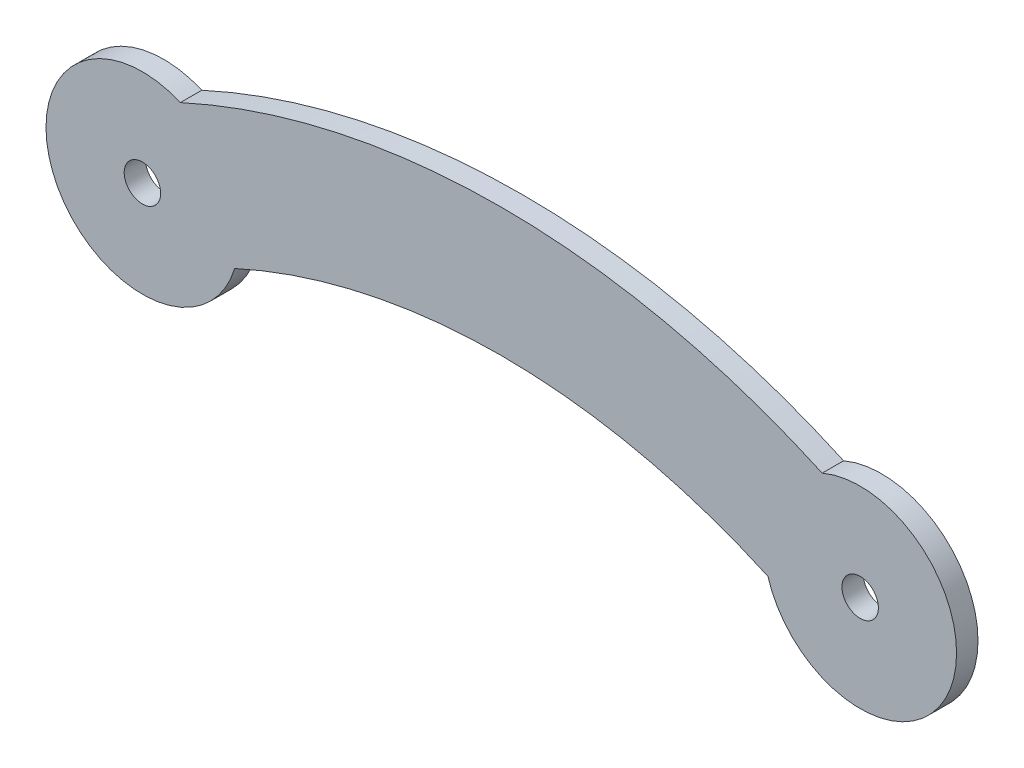
ISO-10303-21;
HEADER;
FILE_DESCRIPTION(('STEP AP214'),'2;1');
FILE_NAME('part.step','',(''),(''),'','','');
FILE_SCHEMA(('AUTOMOTIVE_DESIGN { 1 0 10303 214 1 1 1 1 }'));
ENDSEC;
DATA;
#1=APPLICATION_CONTEXT('core data for automotive mechanical design processes');
#2=APPLICATION_PROTOCOL_DEFINITION('international standard','automotive_design',2000,#1);
#3=PRODUCT_CONTEXT('',#1,'mechanical');
#4=PRODUCT('Part','Part','',(#3));
#5=PRODUCT_RELATED_PRODUCT_CATEGORY('part','',(#4));
#6=PRODUCT_DEFINITION_FORMATION('','',#4);
#7=PRODUCT_DEFINITION_CONTEXT('part definition',#1,'design');
#8=PRODUCT_DEFINITION('design','',#6,#7);
#9=PRODUCT_DEFINITION_SHAPE('','',#8);
#10=(LENGTH_UNIT() NAMED_UNIT(*) SI_UNIT(.MILLI.,.METRE.));
#11=(NAMED_UNIT(*) PLANE_ANGLE_UNIT() SI_UNIT($,.RADIAN.));
#12=(NAMED_UNIT(*) SI_UNIT($,.STERADIAN.) SOLID_ANGLE_UNIT());
#13=UNCERTAINTY_MEASURE_WITH_UNIT(LENGTH_MEASURE(1.E-05),#10,'distance_accuracy_value','');
#14=(GEOMETRIC_REPRESENTATION_CONTEXT(3) GLOBAL_UNCERTAINTY_ASSIGNED_CONTEXT((#13)) GLOBAL_UNIT_ASSIGNED_CONTEXT((#10,
#11,#12)) REPRESENTATION_CONTEXT('',''));
#15=CARTESIAN_POINT('',(0.,0.,0.));
#16=DIRECTION('',(0.,0.,1.));
#17=DIRECTION('',(1.,0.,0.));
#18=AXIS2_PLACEMENT_3D('',#15,#16,#17);
#19=CARTESIAN_POINT('',(25.125,-14.2998387689215,1.));
#20=DIRECTION('',(0.,0.,-1.));
#21=DIRECTION('',(-1.,0.,0.));
#22=AXIS2_PLACEMENT_3D('',#19,#20,#21);
#23=PLANE('',#22);
#24=CARTESIAN_POINT('',(16.75,-28.599677537843,1.));
#25=DIRECTION('',(0.,0.,-1.));
#26=DIRECTION('',(-1.,0.,0.));
#27=AXIS2_PLACEMENT_3D('',#24,#25,#26);
#28=CIRCLE('',#27,30.);
#29=CARTESIAN_POINT('',(4.30766705181558,-1.30153930816647,1.));
#30=VERTEX_POINT('',#29);
#31=CARTESIAN_POINT('',(29.1923329481844,-1.30153930816648,1.));
#32=VERTEX_POINT('',#31);
#33=EDGE_CURVE('E86',#30,#32,#28,.T.);
#34=ORIENTED_EDGE('',*,*,#33,.T.);
#35=CARTESIAN_POINT('',(33.5,0.,1.));
#36=DIRECTION('',(0.,0.,1.));
#37=DIRECTION('',(1.,0.,0.));
#38=AXIS2_PLACEMENT_3D('',#35,#36,#37);
#39=CIRCLE('',#38,4.5);
#40=CARTESIAN_POINT('',(31.7281219469599,4.13647774865944,1.));
#41=VERTEX_POINT('',#40);
#42=EDGE_CURVE('E81',#32,#41,#39,.T.);
#43=ORIENTED_EDGE('',*,*,#42,.T.);
#44=CARTESIAN_POINT('',(16.75,-28.599677537843,1.));
#45=DIRECTION('',(0.,0.,1.));
#46=DIRECTION('',(-1.,0.,0.));
#47=AXIS2_PLACEMENT_3D('',#44,#45,#46);
#48=CIRCLE('',#47,36.);
#49=CARTESIAN_POINT('',(1.77187805304013,4.13647774865944,1.));
#50=VERTEX_POINT('',#49);
#51=EDGE_CURVE('E84',#41,#50,#48,.T.);
#52=ORIENTED_EDGE('',*,*,#51,.T.);
#53=CARTESIAN_POINT('',(0.,0.,1.));
#54=DIRECTION('',(0.,0.,1.));
#55=DIRECTION('',(-1.,0.,0.));
#56=AXIS2_PLACEMENT_3D('',#53,#54,#55);
#57=CIRCLE('',#56,4.5);
#58=EDGE_CURVE('E51',#50,#30,#57,.T.);
#59=ORIENTED_EDGE('',*,*,#58,.T.);
#60=EDGE_LOOP('',(#34,#43,#52,#59));
#61=FACE_BOUND('',#60,.T.);
#62=CARTESIAN_POINT('',(0.,0.,1.));
#63=DIRECTION('',(0.,0.,1.));
#64=DIRECTION('',(1.,0.,0.));
#65=AXIS2_PLACEMENT_3D('',#62,#63,#64);
#66=CIRCLE('',#65,0.85);
#67=CARTESIAN_POINT('',(0.85,0.,1.));
#68=VERTEX_POINT('',#67);
#69=EDGE_CURVE('E101',#68,#68,#66,.T.);
#70=ORIENTED_EDGE('',*,*,#69,.F.);
#71=EDGE_LOOP('',(#70));
#72=FACE_BOUND('',#71,.T.);
#73=CARTESIAN_POINT('',(33.5,0.,1.));
#74=DIRECTION('',(0.,0.,1.));
#75=DIRECTION('',(1.,0.,0.));
#76=AXIS2_PLACEMENT_3D('',#73,#74,#75);
#77=CIRCLE('',#76,0.849999999999999);
#78=CARTESIAN_POINT('',(34.35,0.,1.));
#79=VERTEX_POINT('',#78);
#80=EDGE_CURVE('E116',#79,#79,#77,.T.);
#81=ORIENTED_EDGE('',*,*,#80,.F.);
#82=EDGE_LOOP('',(#81));
#83=FACE_BOUND('',#82,.T.);
#84=ADVANCED_FACE('F34',(#61,#72,#83),#23,.F.);
#85=CARTESIAN_POINT('',(25.125,-14.2998387689215,0.));
#86=DIRECTION('',(0.,0.,-1.));
#87=DIRECTION('',(-1.,0.,0.));
#88=AXIS2_PLACEMENT_3D('',#85,#86,#87);
#89=PLANE('',#88);
#90=CARTESIAN_POINT('',(0.,0.,0.));
#91=DIRECTION('',(0.,0.,1.));
#92=DIRECTION('',(1.,0.,0.));
#93=AXIS2_PLACEMENT_3D('',#90,#91,#92);
#94=CIRCLE('',#93,0.85);
#95=CARTESIAN_POINT('',(0.85,0.,0.));
#96=VERTEX_POINT('',#95);
#97=EDGE_CURVE('E113',#96,#96,#94,.T.);
#98=ORIENTED_EDGE('',*,*,#97,.T.);
#99=EDGE_LOOP('',(#98));
#100=FACE_BOUND('',#99,.T.);
#101=CARTESIAN_POINT('',(16.75,-28.599677537843,0.));
#102=DIRECTION('',(0.,0.,-1.));
#103=DIRECTION('',(-1.,0.,0.));
#104=AXIS2_PLACEMENT_3D('',#101,#102,#103);
#105=CIRCLE('',#104,30.);
#106=CARTESIAN_POINT('',(4.30766705181558,-1.30153930816647,0.));
#107=VERTEX_POINT('',#106);
#108=CARTESIAN_POINT('',(29.1923329481844,-1.30153930816648,0.));
#109=VERTEX_POINT('',#108);
#110=EDGE_CURVE('E98',#107,#109,#105,.T.);
#111=ORIENTED_EDGE('',*,*,#110,.F.);
#112=CARTESIAN_POINT('',(0.,0.,0.));
#113=DIRECTION('',(0.,0.,1.));
#114=DIRECTION('',(-1.,0.,0.));
#115=AXIS2_PLACEMENT_3D('',#112,#113,#114);
#116=CIRCLE('',#115,4.5);
#117=CARTESIAN_POINT('',(1.77187805304013,4.13647774865944,0.));
#118=VERTEX_POINT('',#117);
#119=EDGE_CURVE('E74',#118,#107,#116,.T.);
#120=ORIENTED_EDGE('',*,*,#119,.F.);
#121=CARTESIAN_POINT('',(16.75,-28.599677537843,0.));
#122=DIRECTION('',(0.,0.,1.));
#123=DIRECTION('',(-1.,0.,0.));
#124=AXIS2_PLACEMENT_3D('',#121,#122,#123);
#125=CIRCLE('',#124,36.);
#126=CARTESIAN_POINT('',(31.7281219469599,4.13647774865944,0.));
#127=VERTEX_POINT('',#126);
#128=EDGE_CURVE('E68',#127,#118,#125,.T.);
#129=ORIENTED_EDGE('',*,*,#128,.F.);
#130=CARTESIAN_POINT('',(33.5,0.,0.));
#131=DIRECTION('',(0.,0.,1.));
#132=DIRECTION('',(1.,0.,0.));
#133=AXIS2_PLACEMENT_3D('',#130,#131,#132);
#134=CIRCLE('',#133,4.5);
#135=EDGE_CURVE('E90',#109,#127,#134,.T.);
#136=ORIENTED_EDGE('',*,*,#135,.F.);
#137=EDGE_LOOP('',(#111,#120,#129,#136));
#138=FACE_BOUND('',#137,.T.);
#139=CARTESIAN_POINT('',(33.5,0.,0.));
#140=DIRECTION('',(0.,0.,1.));
#141=DIRECTION('',(1.,0.,0.));
#142=AXIS2_PLACEMENT_3D('',#139,#140,#141);
#143=CIRCLE('',#142,0.849999999999999);
#144=CARTESIAN_POINT('',(34.35,0.,0.));
#145=VERTEX_POINT('',#144);
#146=EDGE_CURVE('E119',#145,#145,#143,.T.);
#147=ORIENTED_EDGE('',*,*,#146,.T.);
#148=EDGE_LOOP('',(#147));
#149=FACE_BOUND('',#148,.T.);
#150=ADVANCED_FACE('F109',(#100,#138,#149),#89,.T.);
#151=CARTESIAN_POINT('',(16.75,-28.599677537843,1.));
#152=DIRECTION('',(0.,0.,-1.));
#153=DIRECTION('',(-1.,0.,0.));
#154=AXIS2_PLACEMENT_3D('',#151,#152,#153);
#155=CYLINDRICAL_SURFACE('',#154,30.);
#156=ORIENTED_EDGE('',*,*,#110,.T.);
#157=DIRECTION('',(0.,0.,-1.));
#158=VECTOR('',#157,1.);
#159=CARTESIAN_POINT('',(29.1923329481844,-1.30153930816648,1.));
#160=LINE('',#159,#158);
#161=EDGE_CURVE('E11',#32,#109,#160,.T.);
#162=ORIENTED_EDGE('',*,*,#161,.F.);
#163=ORIENTED_EDGE('',*,*,#33,.F.);
#164=DIRECTION('',(0.,0.,-1.));
#165=VECTOR('',#164,1.);
#166=CARTESIAN_POINT('',(4.30766705181558,-1.30153930816647,1.));
#167=LINE('',#166,#165);
#168=EDGE_CURVE('E94',#30,#107,#167,.T.);
#169=ORIENTED_EDGE('',*,*,#168,.T.);
#170=EDGE_LOOP('',(#156,#162,#163,#169));
#171=FACE_BOUND('',#170,.T.);
#172=ADVANCED_FACE('F36',(#171),#155,.F.);
#173=CARTESIAN_POINT('',(33.5,0.,1.));
#174=DIRECTION('',(0.,0.,-1.));
#175=DIRECTION('',(-1.,0.,0.));
#176=AXIS2_PLACEMENT_3D('',#173,#174,#175);
#177=CYLINDRICAL_SURFACE('',#176,4.5);
#178=ORIENTED_EDGE('',*,*,#135,.T.);
#179=DIRECTION('',(0.,0.,-1.));
#180=VECTOR('',#179,1.);
#181=CARTESIAN_POINT('',(31.7281219469599,4.13647774865944,1.));
#182=LINE('',#181,#180);
#183=EDGE_CURVE('E43',#41,#127,#182,.T.);
#184=ORIENTED_EDGE('',*,*,#183,.F.);
#185=ORIENTED_EDGE('',*,*,#42,.F.);
#186=ORIENTED_EDGE('',*,*,#161,.T.);
#187=EDGE_LOOP('',(#178,#184,#185,#186));
#188=FACE_BOUND('',#187,.T.);
#189=ADVANCED_FACE('F89',(#188),#177,.T.);
#190=CARTESIAN_POINT('',(16.75,-28.599677537843,1.));
#191=DIRECTION('',(0.,0.,-1.));
#192=DIRECTION('',(-1.,0.,0.));
#193=AXIS2_PLACEMENT_3D('',#190,#191,#192);
#194=CYLINDRICAL_SURFACE('',#193,36.);
#195=ORIENTED_EDGE('',*,*,#128,.T.);
#196=DIRECTION('',(0.,0.,-1.));
#197=VECTOR('',#196,1.);
#198=CARTESIAN_POINT('',(1.77187805304013,4.13647774865944,1.));
#199=LINE('',#198,#197);
#200=EDGE_CURVE('E91',#50,#118,#199,.T.);
#201=ORIENTED_EDGE('',*,*,#200,.F.);
#202=ORIENTED_EDGE('',*,*,#51,.F.);
#203=ORIENTED_EDGE('',*,*,#183,.T.);
#204=EDGE_LOOP('',(#195,#201,#202,#203));
#205=FACE_BOUND('',#204,.T.);
#206=ADVANCED_FACE('F92',(#205),#194,.T.);
#207=CARTESIAN_POINT('',(0.,0.,1.));
#208=DIRECTION('',(0.,0.,-1.));
#209=DIRECTION('',(-1.,0.,0.));
#210=AXIS2_PLACEMENT_3D('',#207,#208,#209);
#211=CYLINDRICAL_SURFACE('',#210,4.5);
#212=ORIENTED_EDGE('',*,*,#119,.T.);
#213=ORIENTED_EDGE('',*,*,#168,.F.);
#214=ORIENTED_EDGE('',*,*,#58,.F.);
#215=ORIENTED_EDGE('',*,*,#200,.T.);
#216=EDGE_LOOP('',(#212,#213,#214,#215));
#217=FACE_BOUND('',#216,.T.);
#218=ADVANCED_FACE('F106',(#217),#211,.T.);
#219=CARTESIAN_POINT('',(0.,0.,1.));
#220=DIRECTION('',(0.,0.,-1.));
#221=DIRECTION('',(-1.,0.,0.));
#222=AXIS2_PLACEMENT_3D('',#219,#220,#221);
#223=CYLINDRICAL_SURFACE('',#222,0.85);
#224=ORIENTED_EDGE('',*,*,#69,.T.);
#225=EDGE_LOOP('',(#224));
#226=FACE_BOUND('',#225,.T.);
#227=ORIENTED_EDGE('',*,*,#97,.F.);
#228=EDGE_LOOP('',(#227));
#229=FACE_BOUND('',#228,.T.);
#230=ADVANCED_FACE('F136',(#226,#229),#223,.F.);
#231=CARTESIAN_POINT('',(33.5,0.,1.));
#232=DIRECTION('',(0.,0.,-1.));
#233=DIRECTION('',(-1.,0.,0.));
#234=AXIS2_PLACEMENT_3D('',#231,#232,#233);
#235=CYLINDRICAL_SURFACE('',#234,0.849999999999999);
#236=ORIENTED_EDGE('',*,*,#80,.T.);
#237=EDGE_LOOP('',(#236));
#238=FACE_BOUND('',#237,.T.);
#239=ORIENTED_EDGE('',*,*,#146,.F.);
#240=EDGE_LOOP('',(#239));
#241=FACE_BOUND('',#240,.T.);
#242=ADVANCED_FACE('F125',(#238,#241),#235,.F.);
#243=CLOSED_SHELL('',(#84,#150,#172,#189,#206,#218,#230,#242));
#244=MANIFOLD_SOLID_BREP('B2',#243);
#245=ADVANCED_BREP_SHAPE_REPRESENTATION('',(#18,#244),#14);
#246=SHAPE_DEFINITION_REPRESENTATION(#9,#245);
ENDSEC;
END-ISO-10303-21;
